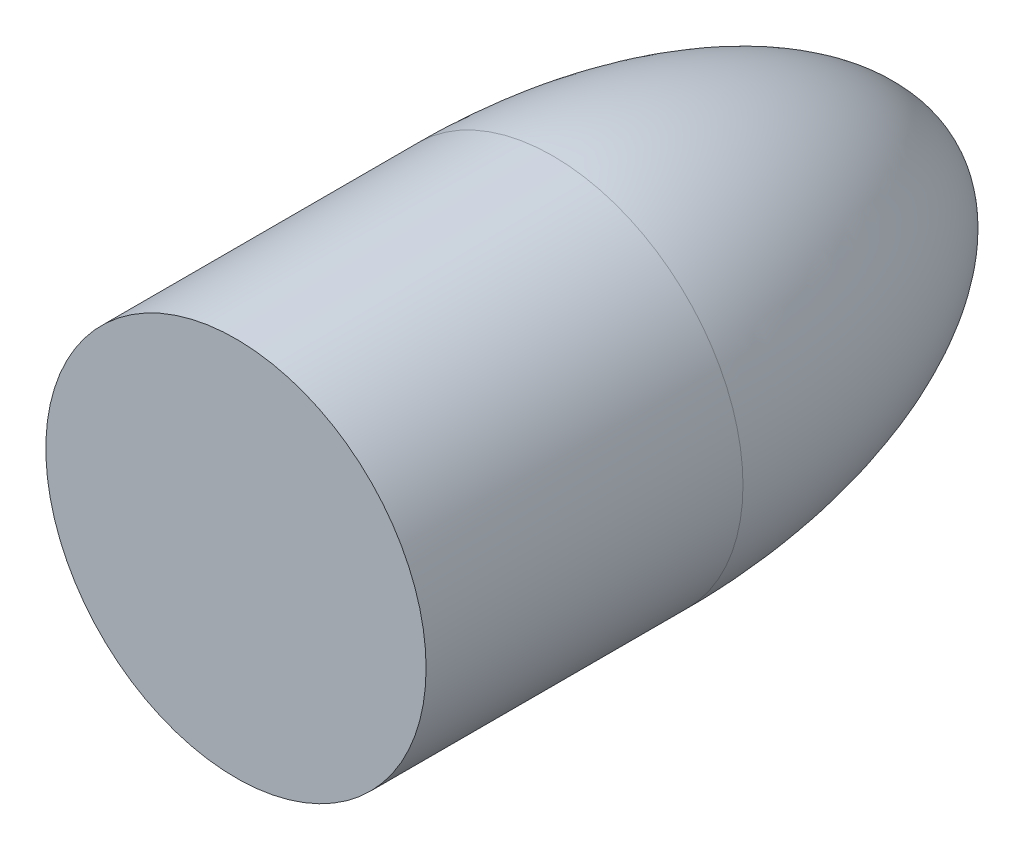
ISO-10303-21;
HEADER;
FILE_DESCRIPTION(('STEP AP214'),'2;1');
FILE_NAME('part.step','',(''),(''),'','','');
FILE_SCHEMA(('AUTOMOTIVE_DESIGN { 1 0 10303 214 1 1 1 1 }'));
ENDSEC;
DATA;
#1=APPLICATION_CONTEXT('core data for automotive mechanical design processes');
#2=APPLICATION_PROTOCOL_DEFINITION('international standard','automotive_design',2000,#1);
#3=PRODUCT_CONTEXT('',#1,'mechanical');
#4=PRODUCT('Part','Part','',(#3));
#5=PRODUCT_RELATED_PRODUCT_CATEGORY('part','',(#4));
#6=PRODUCT_DEFINITION_FORMATION('','',#4);
#7=PRODUCT_DEFINITION_CONTEXT('part definition',#1,'design');
#8=PRODUCT_DEFINITION('design','',#6,#7);
#9=PRODUCT_DEFINITION_SHAPE('','',#8);
#10=(LENGTH_UNIT() NAMED_UNIT(*) SI_UNIT(.MILLI.,.METRE.));
#11=(NAMED_UNIT(*) PLANE_ANGLE_UNIT() SI_UNIT($,.RADIAN.));
#12=(NAMED_UNIT(*) SI_UNIT($,.STERADIAN.) SOLID_ANGLE_UNIT());
#13=UNCERTAINTY_MEASURE_WITH_UNIT(LENGTH_MEASURE(1.E-05),#10,'distance_accuracy_value','');
#14=(GEOMETRIC_REPRESENTATION_CONTEXT(3) GLOBAL_UNCERTAINTY_ASSIGNED_CONTEXT((#13)) GLOBAL_UNIT_ASSIGNED_CONTEXT((#10,
#11,#12)) REPRESENTATION_CONTEXT('',''));
#15=CARTESIAN_POINT('',(0.,0.,0.));
#16=DIRECTION('',(0.,0.,1.));
#17=DIRECTION('',(1.,0.,0.));
#18=AXIS2_PLACEMENT_3D('',#15,#16,#17);
#19=CARTESIAN_POINT('',(0.,0.,127.));
#20=DIRECTION('',(0.,0.,-1.));
#21=DIRECTION('',(-1.,0.,0.));
#22=AXIS2_PLACEMENT_3D('',#19,#20,#21);
#23=CYLINDRICAL_SURFACE('',#22,76.2);
#24=CARTESIAN_POINT('',(0.,0.,127.));
#25=DIRECTION('',(0.,0.,1.));
#26=DIRECTION('',(1.,0.,0.));
#27=AXIS2_PLACEMENT_3D('',#24,#25,#26);
#28=CIRCLE('',#27,76.2);
#29=CARTESIAN_POINT('',(76.2,0.,127.));
#30=VERTEX_POINT('',#29);
#31=EDGE_CURVE('E11',#30,#30,#28,.T.);
#32=ORIENTED_EDGE('',*,*,#31,.F.);
#33=EDGE_LOOP('',(#32));
#34=FACE_BOUND('',#33,.T.);
#35=CARTESIAN_POINT('',(0.,0.,0.));
#36=DIRECTION('',(0.,0.,1.));
#37=DIRECTION('',(1.,0.,0.));
#38=AXIS2_PLACEMENT_3D('',#35,#36,#37);
#39=CIRCLE('',#38,76.2);
#40=CARTESIAN_POINT('',(76.2,0.,0.));
#41=VERTEX_POINT('',#40);
#42=EDGE_CURVE('E51',#41,#41,#39,.T.);
#43=ORIENTED_EDGE('',*,*,#42,.T.);
#44=EDGE_LOOP('',(#43));
#45=FACE_BOUND('',#44,.T.);
#46=ADVANCED_FACE('F41',(#34,#45),#23,.T.);
#47=CARTESIAN_POINT('',(0.,0.,127.));
#48=DIRECTION('',(0.,0.,1.));
#49=DIRECTION('',(1.,0.,0.));
#50=AXIS2_PLACEMENT_3D('',#47,#48,#49);
#51=PLANE('',#50);
#52=ORIENTED_EDGE('',*,*,#31,.T.);
#53=EDGE_LOOP('',(#52));
#54=FACE_BOUND('',#53,.T.);
#55=ADVANCED_FACE('F56',(#54),#51,.T.);
#56=CARTESIAN_POINT('',(0.,0.,-152.400000000058));
#57=CARTESIAN_POINT('',(0.,1.00727516354348,-152.399993954247));
#58=CARTESIAN_POINT('',(0.,2.86766479977393,-152.334424833134));
#59=CARTESIAN_POINT('',(0.,5.58273920007537,-152.061016263015));
#60=CARTESIAN_POINT('',(0.,9.20758572596814,-151.350644993432));
#61=CARTESIAN_POINT('',(0.,12.7150528282243,-150.335170018022));
#62=CARTESIAN_POINT('',(0.,16.2246447892468,-148.978819683395));
#63=CARTESIAN_POINT('',(0.,19.6987317234601,-147.289840932212));
#64=CARTESIAN_POINT('',(0.,23.1057556303082,-145.29561596227));
#65=CARTESIAN_POINT('',(0.,26.7569714660022,-142.786533548315));
#66=CARTESIAN_POINT('',(0.,30.582581398888,-139.702159514465));
#67=CARTESIAN_POINT('',(0.,34.510730011019,-136.001308229732));
#68=CARTESIAN_POINT('',(0.,38.4219560789168,-131.728642673686));
#69=CARTESIAN_POINT('',(0.,42.0474518764335,-127.212316475715));
#70=CARTESIAN_POINT('',(0.,45.9221636884005,-121.774263974294));
#71=CARTESIAN_POINT('',(0.,50.2217258554473,-114.87825149767));
#72=CARTESIAN_POINT('',(0.,54.7218383607193,-106.424617467166));
#73=CARTESIAN_POINT('',(0.,59.2053772820525,-96.3538729219524));
#74=CARTESIAN_POINT('',(0.,62.7230533011218,-86.8489093488286));
#75=CARTESIAN_POINT('',(0.,65.3499233838276,-78.5714363198022));
#76=CARTESIAN_POINT('',(0.,67.6864189143387,-70.2088111440099));
#77=CARTESIAN_POINT('',(0.,69.401449310132,-63.1783650196979));
#78=CARTESIAN_POINT('',(0.,70.8973353817058,-56.0982987942142));
#79=CARTESIAN_POINT('',(0.,72.0551975125631,-49.6901215175773));
#80=CARTESIAN_POINT('',(0.,72.7507169146788,-45.4049975378211));
#81=CARTESIAN_POINT('',(0.,73.2802928294179,-41.8265152884561));
#82=CARTESIAN_POINT('',(0.,73.6742773806088,-38.9592658443511));
#83=CARTESIAN_POINT('',(0.,74.1300446159249,-35.3708726418066));
#84=CARTESIAN_POINT('',(0.,74.6187897133081,-31.056706665176));
#85=CARTESIAN_POINT('',(0.,75.0357756373761,-26.7366011432355));
#86=CARTESIAN_POINT('',(0.,75.38204639552,-22.4077815558686));
#87=CARTESIAN_POINT('',(0.,75.6238711686542,-18.8005594348249));
#88=CARTESIAN_POINT('',(0.,75.7894330012929,-15.9071030028897));
#89=CARTESIAN_POINT('',(0.,75.9272178222078,-13.0244929253475));
#90=CARTESIAN_POINT('',(0.,76.0373261064935,-10.1169910596516));
#91=CARTESIAN_POINT('',(0.,76.1095237525963,-7.6148776066339));
#92=CARTESIAN_POINT('',(0.,76.1541968697501,-5.38985373267047));
#93=CARTESIAN_POINT('',(0.,76.1851163979129,-3.34755090049925));
#94=CARTESIAN_POINT('',(0.,76.1965653221107,-1.65837717248657));
#95=CARTESIAN_POINT('',(0.,76.2000000000003,-0.668289371502083));
#96=CARTESIAN_POINT('',(0.,76.2,5.7587930591075E-11));
#97=B_SPLINE_CURVE_WITH_KNOTS('',4,(#56,#57,#58,#59,#60,#61,#62,#63,#64,#65,#66,#67,#68,#69,#70,
#71,#72,#73,#74,#75,#76,#77,#78,#79,#80,#81,#82,#83,#84,#85,#86,#87,#88,#89,#90,#91,#92,#93,#94,
#95,#96),.UNSPECIFIED.,.F.,.F.,(5,1,1,1,1,1,1,1,1,1,1,1,1,1,1,1,1,1,1,1,1,1,1,1,1,1,1,1,1,1,1,1,
1,1,1,1,1,5),(0.076303915739435,0.0964665298073096,0.113550529223601,0.130843004163998,
0.150159124566602,0.169469618819582,0.188778691464428,0.208090209237064,0.229117608309433,
0.258084503899454,0.287051412296125,0.316018504613756,0.344985536133609,0.373952674842448,
0.420657606604237,0.478591828375639,0.536526038173599,0.594460277713587,0.623427405195765,
0.652394532677944,0.710328777982902,0.739295898519441,0.76826301905598,0.782746580875129,
0.797230142694278,0.811713704513427,0.826197266332576,0.855164387345043,0.884131508357509,
0.898615069805969,0.913098631254429,0.927582192702889,0.942065754151349,0.956549315613512,
0.971032877075674,0.978274657806756,0.985516438537837,1.),.UNSPECIFIED.);
#98=CARTESIAN_POINT('',(0.,0.,-480.060000000396));
#99=DIRECTION('',(0.,0.,-1.));
#100=AXIS1_PLACEMENT('',#98,#99);
#101=SURFACE_OF_REVOLUTION('',#97,#100);
#102=ORIENTED_EDGE('',*,*,#42,.F.);
#103=EDGE_LOOP('',(#102));
#104=FACE_BOUND('',#103,.T.);
#105=CARTESIAN_POINT('',(0.,0.,-152.400000000058));
#106=VERTEX_POINT('',#105);
#107=VERTEX_LOOP('',#106);
#108=FACE_BOUND('',#107,.T.);
#109=ADVANCED_FACE('F43',(#104,#108),#101,.F.);
#110=CLOSED_SHELL('',(#46,#55,#109));
#111=MANIFOLD_SOLID_BREP('B2',#110);
#112=ADVANCED_BREP_SHAPE_REPRESENTATION('',(#18,#111),#14);
#113=SHAPE_DEFINITION_REPRESENTATION(#9,#112);
ENDSEC;
END-ISO-10303-21;
